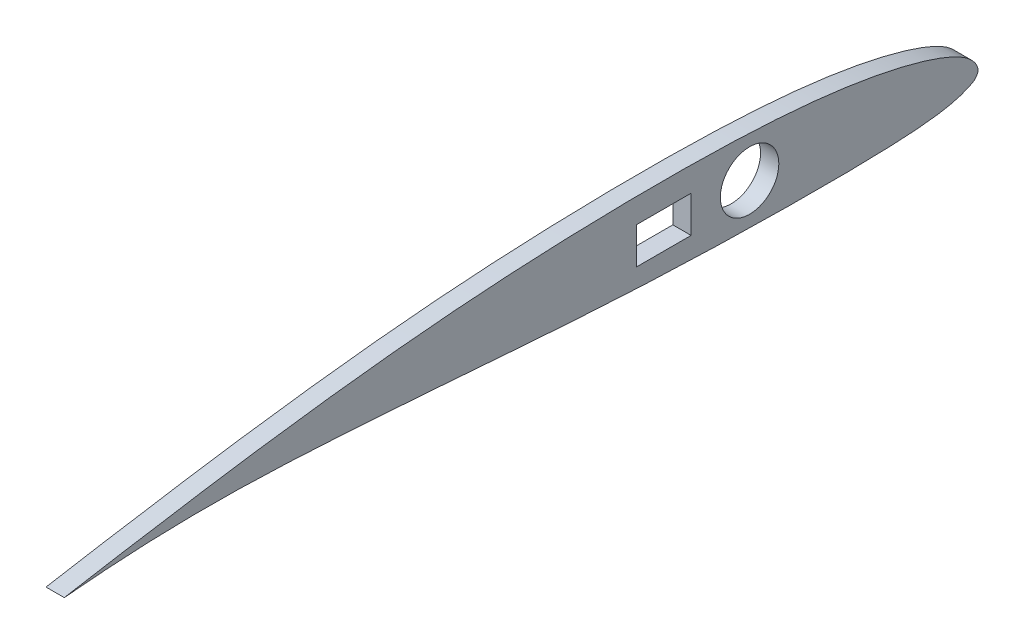
ISO-10303-21;
HEADER;
FILE_DESCRIPTION(('STEP AP214'),'2;1');
FILE_NAME('part.step','',(''),(''),'','','');
FILE_SCHEMA(('AUTOMOTIVE_DESIGN { 1 0 10303 214 1 1 1 1 }'));
ENDSEC;
DATA;
#1=APPLICATION_CONTEXT('core data for automotive mechanical design processes');
#2=APPLICATION_PROTOCOL_DEFINITION('international standard','automotive_design',2000,#1);
#3=PRODUCT_CONTEXT('',#1,'mechanical');
#4=PRODUCT('Part','Part','',(#3));
#5=PRODUCT_RELATED_PRODUCT_CATEGORY('part','',(#4));
#6=PRODUCT_DEFINITION_FORMATION('','',#4);
#7=PRODUCT_DEFINITION_CONTEXT('part definition',#1,'design');
#8=PRODUCT_DEFINITION('design','',#6,#7);
#9=PRODUCT_DEFINITION_SHAPE('','',#8);
#10=(LENGTH_UNIT() NAMED_UNIT(*) SI_UNIT(.MILLI.,.METRE.));
#11=(NAMED_UNIT(*) PLANE_ANGLE_UNIT() SI_UNIT($,.RADIAN.));
#12=(NAMED_UNIT(*) SI_UNIT($,.STERADIAN.) SOLID_ANGLE_UNIT());
#13=UNCERTAINTY_MEASURE_WITH_UNIT(LENGTH_MEASURE(1.E-05),#10,'distance_accuracy_value','');
#14=(GEOMETRIC_REPRESENTATION_CONTEXT(3) GLOBAL_UNCERTAINTY_ASSIGNED_CONTEXT((#13)) GLOBAL_UNIT_ASSIGNED_CONTEXT((#10,
#11,#12)) REPRESENTATION_CONTEXT('',''));
#15=CARTESIAN_POINT('',(0.,0.,0.));
#16=DIRECTION('',(0.,0.,1.));
#17=DIRECTION('',(1.,0.,0.));
#18=AXIS2_PLACEMENT_3D('',#15,#16,#17);
#19=CARTESIAN_POINT('',(5.,1.49711132773622,0.435092083404368));
#20=DIRECTION('',(-1.,0.,0.));
#21=DIRECTION('',(0.,0.,1.));
#22=AXIS2_PLACEMENT_3D('',#19,#20,#21);
#23=PLANE('',#22);
#24=CARTESIAN_POINT('',(5.,5.07732270373844,62.4999197093942));
#25=DIRECTION('',(1.,0.,0.));
#26=DIRECTION('',(0.,0.,-1.));
#27=AXIS2_PLACEMENT_3D('',#24,#25,#26);
#28=CIRCLE('',#27,8.);
#29=CARTESIAN_POINT('',(5.,5.07732270373844,54.4999197093942));
#30=VERTEX_POINT('',#29);
#31=EDGE_CURVE('E112',#30,#30,#28,.T.);
#32=ORIENTED_EDGE('',*,*,#31,.F.);
#33=EDGE_LOOP('',(#32));
#34=FACE_BOUND('',#33,.T.);
#35=CARTESIAN_POINT('',(5.,0.,250.));
#36=CARTESIAN_POINT('',(5.,-0.0080427959719715,250.000228293678));
#37=CARTESIAN_POINT('',(5.,0.172375657967406,248.284955515532));
#38=CARTESIAN_POINT('',(5.,0.308690014795419,246.518112419387));
#39=CARTESIAN_POINT('',(5.,0.685693593852336,242.189387343398));
#40=CARTESIAN_POINT('',(5.,1.07410152891603,236.806461263496));
#41=CARTESIAN_POINT('',(5.,1.49731723995003,229.680385951639));
#42=CARTESIAN_POINT('',(5.,1.8232186026768,221.18415869828));
#43=CARTESIAN_POINT('',(5.,1.96762610068065,211.337618207726));
#44=CARTESIAN_POINT('',(5.,1.83322105638369,200.371188527109));
#45=CARTESIAN_POINT('',(5.,1.38960528984164,188.499913622482));
#46=CARTESIAN_POINT('',(5.,0.706014078000893,175.953687417433));
#47=CARTESIAN_POINT('',(5.,-0.160208641561513,162.931424917666));
#48=CARTESIAN_POINT('',(5.,-1.14801632724376,149.615771743617));
#49=CARTESIAN_POINT('',(5.,-2.19092490983926,136.176354994724));
#50=CARTESIAN_POINT('',(5.,-3.21958397917046,122.767140548026));
#51=CARTESIAN_POINT('',(5.,-4.15274312671142,109.520053587455));
#52=CARTESIAN_POINT('',(5.,-4.93856436487493,96.5460959745437));
#53=CARTESIAN_POINT('',(5.,-5.53683070268675,83.9408193016427));
#54=CARTESIAN_POINT('',(5.,-5.94764820461108,71.8018392906514));
#55=CARTESIAN_POINT('',(5.,-6.21845093878312,60.2452560030716));
#56=CARTESIAN_POINT('',(5.,-6.35536975583973,49.3987328907547));
#57=CARTESIAN_POINT('',(5.,-6.38138796281789,39.3972261942655));
#58=CARTESIAN_POINT('',(5.,-6.26504923032313,30.3619348419668));
#59=CARTESIAN_POINT('',(5.,-6.01216491688521,22.4121811031587));
#60=CARTESIAN_POINT('',(5.,-5.59743390072595,15.6262272306516));
#61=CARTESIAN_POINT('',(5.,-4.92870657935606,10.0719075109048));
#62=CARTESIAN_POINT('',(5.,-4.04044698146404,5.69769261214423));
#63=CARTESIAN_POINT('',(5.,-2.8657529844069,2.62532063874475));
#64=CARTESIAN_POINT('',(5.,-1.7115284699546,0.494884225045661));
#65=CARTESIAN_POINT('',(5.,-0.410454230626488,-0.0213125491030087));
#66=CARTESIAN_POINT('',(5.,0.792659826704065,0.0311691995850224));
#67=CARTESIAN_POINT('',(5.,2.30568433693192,0.812599241892923));
#68=CARTESIAN_POINT('',(5.,4.23835242447377,2.72886351673443));
#69=CARTESIAN_POINT('',(5.,6.11817212106947,5.76990724125498));
#70=CARTESIAN_POINT('',(5.,7.91359420170391,9.88094280419771));
#71=CARTESIAN_POINT('',(5.,9.64131817838287,15.0749304677094));
#72=CARTESIAN_POINT('',(5.,11.2838964878058,21.2987522216172));
#73=CARTESIAN_POINT('',(5.,12.7883817585812,28.4971721202648));
#74=CARTESIAN_POINT('',(5.,14.0978349081275,36.6073734062479));
#75=CARTESIAN_POINT('',(5.,15.1594290171638,45.573028440303));
#76=CARTESIAN_POINT('',(5.,15.9609039979753,55.3329100744701));
#77=CARTESIAN_POINT('',(5.,16.4940697383882,65.8165364983871));
#78=CARTESIAN_POINT('',(5.,16.7919897051422,76.9313762604552));
#79=CARTESIAN_POINT('',(5.,16.864754130909,88.5669490281142));
#80=CARTESIAN_POINT('',(5.,16.7267152914356,100.596999885542));
#81=CARTESIAN_POINT('',(5.,16.3833850637257,112.888825982424));
#82=CARTESIAN_POINT('',(5.,15.825573666627,125.31161581915));
#83=CARTESIAN_POINT('',(5.,15.0523318700684,137.743791097076));
#84=CARTESIAN_POINT('',(5.,14.0593390742259,150.072384382085));
#85=CARTESIAN_POINT('',(5.,12.8815869860292,162.191375055682));
#86=CARTESIAN_POINT('',(5.,11.5492803460744,173.989074322246));
#87=CARTESIAN_POINT('',(5.,10.1162497290333,185.35236444642));
#88=CARTESIAN_POINT('',(5.,8.63237912523508,196.163081697706));
#89=CARTESIAN_POINT('',(5.,7.13151388385034,206.300441402258));
#90=CARTESIAN_POINT('',(5.,5.73122176805054,215.560350587015));
#91=CARTESIAN_POINT('',(5.,4.29329512716244,223.97715704258));
#92=CARTESIAN_POINT('',(5.,3.1818088737293,231.363413336396));
#93=CARTESIAN_POINT('',(5.,2.09894241729889,237.746440904332));
#94=CARTESIAN_POINT('',(5.,1.2458619166603,242.622069365861));
#95=CARTESIAN_POINT('',(5.,0.552864946230777,246.64452933247));
#96=CARTESIAN_POINT('',(5.,0.246216764640028,248.328398440367));
#97=CARTESIAN_POINT('',(5.,0.00797737724443801,249.999773563223));
#98=CARTESIAN_POINT('',(5.,0.,250.));
#99=B_SPLINE_CURVE_WITH_KNOTS('',3,(#35,#36,#37,#38,#39,#40,#41,#42,#43,#44,#45,#46,#47,#48,#49,
#50,#51,#52,#53,#54,#55,#56,#57,#58,#59,#60,#61,#62,#63,#64,#65,#66,#67,#68,#69,#70,#71,#72,#73,
#74,#75,#76,#77,#78,#79,#80,#81,#82,#83,#84,#85,#86,#87,#88,#89,#90,#91,#92,#93,#94,#95,#96,#97,
#98),.UNSPECIFIED.,.T.,.F.,(4,1,1,1,1,1,1,1,1,1,1,1,1,1,1,1,1,1,1,1,1,1,1,1,1,1,1,1,1,1,1,1,1,1,
1,1,1,1,1,1,1,1,1,1,1,1,1,1,1,1,1,1,1,1,1,1,1,1,1,1,1,4),(0.,0.00158888881614516,
0.00632921783555629,0.0142024564897436,0.0251728077530557,0.0391734833267743,0.0560606311759249,
0.0755789238487882,0.0973636066296903,0.120926258366677,0.145825281006277,0.171670911815127,
0.198108536705041,0.22479018357162,0.25139057978404,0.277643490654311,0.303326750051388,
0.328257458029316,0.352272548115194,0.375156061746876,0.396620664402003,0.416422729294005,
0.434304420097656,0.450054679859308,0.463465465082325,0.474478994238096,0.483169222153171,
0.489678354497499,0.494104066315722,0.496910015324886,0.497289784891853,0.501214273282496,
0.506457950332762,0.51335695674223,0.522168631834455,0.53296596992453,0.545689209241574,
0.56022077890382,0.57643892310517,0.594258689005965,0.613600244568652,0.634342385932902,
0.656331109263004,0.679351893859712,0.703152302846811,0.727478208080039,0.7520707394079,
0.776691163534608,0.801140183976245,0.825214386971546,0.848697423570622,0.871352857669295,
0.892947448931157,0.913230871058069,0.931955467148994,0.94834206907442,0.963693004275676,
0.976235918239566,0.986320058750392,0.993788799349345,0.998424034933867,1.),.UNSPECIFIED.);
#100=CARTESIAN_POINT('',(5.,0.,250.));
#101=VERTEX_POINT('',#100);
#102=EDGE_CURVE('E11',#101,#101,#99,.T.);
#103=ORIENTED_EDGE('',*,*,#102,.T.);
#104=EDGE_LOOP('',(#103));
#105=FACE_BOUND('',#104,.T.);
#106=DIRECTION('',(0.,1.,0.));
#107=VECTOR('',#106,1.);
#108=CARTESIAN_POINT('',(5.,10.0773227037384,78.4999197093942));
#109=LINE('',#108,#107);
#110=CARTESIAN_POINT('',(5.,0.0773227037384437,78.4999197093942));
#111=VERTEX_POINT('',#110);
#112=CARTESIAN_POINT('',(5.,10.0773227037384,78.4999197093942));
#113=VERTEX_POINT('',#112);
#114=EDGE_CURVE('E76',#111,#113,#109,.T.);
#115=ORIENTED_EDGE('',*,*,#114,.F.);
#116=DIRECTION('',(0.,0.,-1.));
#117=VECTOR('',#116,1.);
#118=CARTESIAN_POINT('',(5.,0.0773227037384437,78.4999197093942));
#119=LINE('',#118,#117);
#120=CARTESIAN_POINT('',(5.,0.0773227037384437,93.4999197093942));
#121=VERTEX_POINT('',#120);
#122=EDGE_CURVE('E98',#121,#111,#119,.T.);
#123=ORIENTED_EDGE('',*,*,#122,.F.);
#124=DIRECTION('',(0.,-1.,0.));
#125=VECTOR('',#124,1.);
#126=CARTESIAN_POINT('',(5.,10.0773227037384,93.4999197093942));
#127=LINE('',#126,#125);
#128=CARTESIAN_POINT('',(5.,10.0773227037384,93.4999197093942));
#129=VERTEX_POINT('',#128);
#130=EDGE_CURVE('E96',#129,#121,#127,.T.);
#131=ORIENTED_EDGE('',*,*,#130,.F.);
#132=DIRECTION('',(0.,0.,1.));
#133=VECTOR('',#132,1.);
#134=CARTESIAN_POINT('',(5.,10.0773227037384,78.4999197093942));
#135=LINE('',#134,#133);
#136=EDGE_CURVE('E84',#113,#129,#135,.T.);
#137=ORIENTED_EDGE('',*,*,#136,.F.);
#138=EDGE_LOOP('',(#115,#123,#131,#137));
#139=FACE_BOUND('',#138,.T.);
#140=ADVANCED_FACE('F33',(#34,#105,#139),#23,.F.);
#141=CARTESIAN_POINT('',(0.,1.49711132773622,0.435092083404368));
#142=DIRECTION('',(-1.,0.,0.));
#143=DIRECTION('',(0.,0.,1.));
#144=AXIS2_PLACEMENT_3D('',#141,#142,#143);
#145=PLANE('',#144);
#146=CARTESIAN_POINT('',(0.,0.,250.));
#147=CARTESIAN_POINT('',(0.,-0.0080427959719715,250.000228293678));
#148=CARTESIAN_POINT('',(0.,0.172375657967406,248.284955515532));
#149=CARTESIAN_POINT('',(0.,0.308690014795419,246.518112419387));
#150=CARTESIAN_POINT('',(0.,0.685693593852336,242.189387343398));
#151=CARTESIAN_POINT('',(0.,1.07410152891603,236.806461263496));
#152=CARTESIAN_POINT('',(0.,1.49731723995003,229.680385951639));
#153=CARTESIAN_POINT('',(0.,1.8232186026768,221.18415869828));
#154=CARTESIAN_POINT('',(0.,1.96762610068065,211.337618207726));
#155=CARTESIAN_POINT('',(0.,1.83322105638369,200.371188527109));
#156=CARTESIAN_POINT('',(0.,1.38960528984164,188.499913622482));
#157=CARTESIAN_POINT('',(0.,0.706014078000893,175.953687417433));
#158=CARTESIAN_POINT('',(0.,-0.160208641561513,162.931424917666));
#159=CARTESIAN_POINT('',(0.,-1.14801632724376,149.615771743617));
#160=CARTESIAN_POINT('',(0.,-2.19092490983926,136.176354994724));
#161=CARTESIAN_POINT('',(0.,-3.21958397917046,122.767140548026));
#162=CARTESIAN_POINT('',(0.,-4.15274312671142,109.520053587455));
#163=CARTESIAN_POINT('',(0.,-4.93856436487493,96.5460959745437));
#164=CARTESIAN_POINT('',(0.,-5.53683070268675,83.9408193016427));
#165=CARTESIAN_POINT('',(0.,-5.94764820461108,71.8018392906514));
#166=CARTESIAN_POINT('',(0.,-6.21845093878312,60.2452560030716));
#167=CARTESIAN_POINT('',(0.,-6.35536975583973,49.3987328907547));
#168=CARTESIAN_POINT('',(0.,-6.38138796281789,39.3972261942655));
#169=CARTESIAN_POINT('',(0.,-6.26504923032313,30.3619348419668));
#170=CARTESIAN_POINT('',(0.,-6.01216491688521,22.4121811031587));
#171=CARTESIAN_POINT('',(0.,-5.59743390072595,15.6262272306516));
#172=CARTESIAN_POINT('',(0.,-4.92870657935606,10.0719075109048));
#173=CARTESIAN_POINT('',(0.,-4.04044698146404,5.69769261214423));
#174=CARTESIAN_POINT('',(0.,-2.8657529844069,2.62532063874475));
#175=CARTESIAN_POINT('',(0.,-1.7115284699546,0.494884225045661));
#176=CARTESIAN_POINT('',(0.,-0.410454230626488,-0.0213125491030087));
#177=CARTESIAN_POINT('',(0.,0.792659826704065,0.0311691995850224));
#178=CARTESIAN_POINT('',(0.,2.30568433693192,0.812599241892923));
#179=CARTESIAN_POINT('',(0.,4.23835242447377,2.72886351673443));
#180=CARTESIAN_POINT('',(0.,6.11817212106947,5.76990724125498));
#181=CARTESIAN_POINT('',(0.,7.91359420170391,9.88094280419771));
#182=CARTESIAN_POINT('',(0.,9.64131817838287,15.0749304677094));
#183=CARTESIAN_POINT('',(0.,11.2838964878058,21.2987522216172));
#184=CARTESIAN_POINT('',(0.,12.7883817585812,28.4971721202648));
#185=CARTESIAN_POINT('',(0.,14.0978349081275,36.6073734062479));
#186=CARTESIAN_POINT('',(0.,15.1594290171638,45.573028440303));
#187=CARTESIAN_POINT('',(0.,15.9609039979753,55.3329100744701));
#188=CARTESIAN_POINT('',(0.,16.4940697383882,65.8165364983871));
#189=CARTESIAN_POINT('',(0.,16.7919897051422,76.9313762604552));
#190=CARTESIAN_POINT('',(0.,16.864754130909,88.5669490281142));
#191=CARTESIAN_POINT('',(0.,16.7267152914356,100.596999885542));
#192=CARTESIAN_POINT('',(0.,16.3833850637257,112.888825982424));
#193=CARTESIAN_POINT('',(0.,15.825573666627,125.31161581915));
#194=CARTESIAN_POINT('',(0.,15.0523318700684,137.743791097076));
#195=CARTESIAN_POINT('',(0.,14.0593390742259,150.072384382085));
#196=CARTESIAN_POINT('',(0.,12.8815869860292,162.191375055682));
#197=CARTESIAN_POINT('',(0.,11.5492803460744,173.989074322246));
#198=CARTESIAN_POINT('',(0.,10.1162497290333,185.35236444642));
#199=CARTESIAN_POINT('',(0.,8.63237912523508,196.163081697706));
#200=CARTESIAN_POINT('',(0.,7.13151388385034,206.300441402258));
#201=CARTESIAN_POINT('',(0.,5.73122176805054,215.560350587015));
#202=CARTESIAN_POINT('',(0.,4.29329512716244,223.97715704258));
#203=CARTESIAN_POINT('',(0.,3.1818088737293,231.363413336396));
#204=CARTESIAN_POINT('',(0.,2.09894241729889,237.746440904332));
#205=CARTESIAN_POINT('',(0.,1.2458619166603,242.622069365861));
#206=CARTESIAN_POINT('',(0.,0.552864946230777,246.64452933247));
#207=CARTESIAN_POINT('',(0.,0.246216764640028,248.328398440367));
#208=CARTESIAN_POINT('',(0.,0.00797737724443801,249.999773563223));
#209=CARTESIAN_POINT('',(0.,0.,250.));
#210=B_SPLINE_CURVE_WITH_KNOTS('',3,(#146,#147,#148,#149,#150,#151,#152,#153,#154,#155,#156,
#157,#158,#159,#160,#161,#162,#163,#164,#165,#166,#167,#168,#169,#170,#171,#172,#173,#174,#175,
#176,#177,#178,#179,#180,#181,#182,#183,#184,#185,#186,#187,#188,#189,#190,#191,#192,#193,#194,
#195,#196,#197,#198,#199,#200,#201,#202,#203,#204,#205,#206,#207,#208,#209),.UNSPECIFIED.,.T.,
.F.,(4,1,1,1,1,1,1,1,1,1,1,1,1,1,1,1,1,1,1,1,1,1,1,1,1,1,1,1,1,1,1,1,1,1,1,1,1,1,1,1,1,1,1,1,1,
1,1,1,1,1,1,1,1,1,1,1,1,1,1,1,1,4),(0.,0.00158888881614516,0.00632921783555629,
0.0142024564897436,0.0251728077530557,0.0391734833267743,0.0560606311759249,0.0755789238487882,
0.0973636066296903,0.120926258366677,0.145825281006277,0.171670911815127,0.198108536705041,
0.22479018357162,0.25139057978404,0.277643490654311,0.303326750051388,0.328257458029316,
0.352272548115194,0.375156061746876,0.396620664402003,0.416422729294005,0.434304420097656,
0.450054679859308,0.463465465082325,0.474478994238096,0.483169222153171,0.489678354497499,
0.494104066315722,0.496910015324886,0.497289784891853,0.501214273282496,0.506457950332762,
0.51335695674223,0.522168631834455,0.53296596992453,0.545689209241574,0.56022077890382,
0.57643892310517,0.594258689005965,0.613600244568652,0.634342385932902,0.656331109263004,
0.679351893859712,0.703152302846811,0.727478208080039,0.7520707394079,0.776691163534608,
0.801140183976245,0.825214386971546,0.848697423570622,0.871352857669295,0.892947448931157,
0.913230871058069,0.931955467148994,0.94834206907442,0.963693004275676,0.976235918239566,
0.986320058750392,0.993788799349345,0.998424034933867,1.),.UNSPECIFIED.);
#211=CARTESIAN_POINT('',(0.,0.,250.));
#212=VERTEX_POINT('',#211);
#213=EDGE_CURVE('E38',#212,#212,#210,.T.);
#214=ORIENTED_EDGE('',*,*,#213,.F.);
#215=EDGE_LOOP('',(#214));
#216=FACE_BOUND('',#215,.T.);
#217=CARTESIAN_POINT('',(0.,5.07732270373844,62.4999197093942));
#218=DIRECTION('',(1.,0.,0.));
#219=DIRECTION('',(0.,0.,-1.));
#220=AXIS2_PLACEMENT_3D('',#217,#218,#219);
#221=CIRCLE('',#220,8.);
#222=CARTESIAN_POINT('',(0.,5.07732270373844,54.4999197093942));
#223=VERTEX_POINT('',#222);
#224=EDGE_CURVE('E92',#223,#223,#221,.T.);
#225=ORIENTED_EDGE('',*,*,#224,.T.);
#226=EDGE_LOOP('',(#225));
#227=FACE_BOUND('',#226,.T.);
#228=DIRECTION('',(0.,0.,-1.));
#229=VECTOR('',#228,1.);
#230=CARTESIAN_POINT('',(0.,0.0773227037384437,78.4999197093942));
#231=LINE('',#230,#229);
#232=CARTESIAN_POINT('',(0.,0.0773227037384437,93.4999197093942));
#233=VERTEX_POINT('',#232);
#234=CARTESIAN_POINT('',(0.,0.0773227037384437,78.4999197093942));
#235=VERTEX_POINT('',#234);
#236=EDGE_CURVE('E85',#233,#235,#231,.T.);
#237=ORIENTED_EDGE('',*,*,#236,.T.);
#238=DIRECTION('',(0.,1.,0.));
#239=VECTOR('',#238,1.);
#240=CARTESIAN_POINT('',(0.,10.0773227037384,78.4999197093942));
#241=LINE('',#240,#239);
#242=CARTESIAN_POINT('',(0.,10.0773227037384,78.4999197093942));
#243=VERTEX_POINT('',#242);
#244=EDGE_CURVE('E58',#235,#243,#241,.T.);
#245=ORIENTED_EDGE('',*,*,#244,.T.);
#246=DIRECTION('',(0.,0.,1.));
#247=VECTOR('',#246,1.);
#248=CARTESIAN_POINT('',(0.,10.0773227037384,78.4999197093942));
#249=LINE('',#248,#247);
#250=CARTESIAN_POINT('',(0.,10.0773227037384,93.4999197093942));
#251=VERTEX_POINT('',#250);
#252=EDGE_CURVE('E91',#243,#251,#249,.T.);
#253=ORIENTED_EDGE('',*,*,#252,.T.);
#254=DIRECTION('',(0.,-1.,0.));
#255=VECTOR('',#254,1.);
#256=CARTESIAN_POINT('',(0.,10.0773227037384,93.4999197093942));
#257=LINE('',#256,#255);
#258=EDGE_CURVE('E104',#251,#233,#257,.T.);
#259=ORIENTED_EDGE('',*,*,#258,.T.);
#260=EDGE_LOOP('',(#237,#245,#253,#259));
#261=FACE_BOUND('',#260,.T.);
#262=ADVANCED_FACE('F124',(#216,#227,#261),#145,.T.);
#263=DIRECTION('',(-1.,0.,0.));
#264=VECTOR('',#263,1.);
#265=SURFACE_OF_LINEAR_EXTRUSION('',#99,#264);
#266=ORIENTED_EDGE('',*,*,#102,.F.);
#267=EDGE_LOOP('',(#266));
#268=FACE_BOUND('',#267,.T.);
#269=ORIENTED_EDGE('',*,*,#213,.T.);
#270=EDGE_LOOP('',(#269));
#271=FACE_BOUND('',#270,.T.);
#272=ADVANCED_FACE('F35',(#268,#271),#265,.F.);
#273=CARTESIAN_POINT('',(5.,5.07732270373844,62.4999197093942));
#274=DIRECTION('',(-1.,0.,0.));
#275=DIRECTION('',(0.,0.,1.));
#276=AXIS2_PLACEMENT_3D('',#273,#274,#275);
#277=CYLINDRICAL_SURFACE('',#276,8.);
#278=ORIENTED_EDGE('',*,*,#31,.T.);
#279=EDGE_LOOP('',(#278));
#280=FACE_BOUND('',#279,.T.);
#281=ORIENTED_EDGE('',*,*,#224,.F.);
#282=EDGE_LOOP('',(#281));
#283=FACE_BOUND('',#282,.T.);
#284=ADVANCED_FACE('F127',(#280,#283),#277,.F.);
#285=CARTESIAN_POINT('',(5.,10.0773227037384,78.4999197093942));
#286=DIRECTION('',(0.,0.,1.));
#287=DIRECTION('',(1.,0.,0.));
#288=AXIS2_PLACEMENT_3D('',#285,#286,#287);
#289=PLANE('',#288);
#290=ORIENTED_EDGE('',*,*,#244,.F.);
#291=DIRECTION('',(-1.,0.,0.));
#292=VECTOR('',#291,1.);
#293=CARTESIAN_POINT('',(5.,0.0773227037384437,78.4999197093942));
#294=LINE('',#293,#292);
#295=EDGE_CURVE('E80',#111,#235,#294,.T.);
#296=ORIENTED_EDGE('',*,*,#295,.F.);
#297=ORIENTED_EDGE('',*,*,#114,.T.);
#298=DIRECTION('',(-1.,0.,0.));
#299=VECTOR('',#298,1.);
#300=CARTESIAN_POINT('',(5.,10.0773227037384,78.4999197093942));
#301=LINE('',#300,#299);
#302=EDGE_CURVE('E79',#113,#243,#301,.T.);
#303=ORIENTED_EDGE('',*,*,#302,.T.);
#304=EDGE_LOOP('',(#290,#296,#297,#303));
#305=FACE_BOUND('',#304,.T.);
#306=ADVANCED_FACE('F78',(#305),#289,.T.);
#307=CARTESIAN_POINT('',(5.,10.0773227037384,78.4999197093942));
#308=DIRECTION('',(0.,-1.,0.));
#309=DIRECTION('',(0.,0.,-1.));
#310=AXIS2_PLACEMENT_3D('',#307,#308,#309);
#311=PLANE('',#310);
#312=ORIENTED_EDGE('',*,*,#252,.F.);
#313=ORIENTED_EDGE('',*,*,#302,.F.);
#314=ORIENTED_EDGE('',*,*,#136,.T.);
#315=DIRECTION('',(-1.,0.,0.));
#316=VECTOR('',#315,1.);
#317=CARTESIAN_POINT('',(5.,10.0773227037384,93.4999197093942));
#318=LINE('',#317,#316);
#319=EDGE_CURVE('E93',#129,#251,#318,.T.);
#320=ORIENTED_EDGE('',*,*,#319,.T.);
#321=EDGE_LOOP('',(#312,#313,#314,#320));
#322=FACE_BOUND('',#321,.T.);
#323=ADVANCED_FACE('F88',(#322),#311,.T.);
#324=CARTESIAN_POINT('',(5.,10.0773227037384,93.4999197093942));
#325=DIRECTION('',(0.,0.,-1.));
#326=DIRECTION('',(-1.,0.,0.));
#327=AXIS2_PLACEMENT_3D('',#324,#325,#326);
#328=PLANE('',#327);
#329=ORIENTED_EDGE('',*,*,#258,.F.);
#330=ORIENTED_EDGE('',*,*,#319,.F.);
#331=ORIENTED_EDGE('',*,*,#130,.T.);
#332=DIRECTION('',(-1.,0.,0.));
#333=VECTOR('',#332,1.);
#334=CARTESIAN_POINT('',(5.,0.0773227037384437,93.4999197093942));
#335=LINE('',#334,#333);
#336=EDGE_CURVE('E50',#121,#233,#335,.T.);
#337=ORIENTED_EDGE('',*,*,#336,.T.);
#338=EDGE_LOOP('',(#329,#330,#331,#337));
#339=FACE_BOUND('',#338,.T.);
#340=ADVANCED_FACE('F175',(#339),#328,.T.);
#341=CARTESIAN_POINT('',(5.,0.0773227037384437,78.4999197093942));
#342=DIRECTION('',(0.,1.,0.));
#343=DIRECTION('',(0.,0.,1.));
#344=AXIS2_PLACEMENT_3D('',#341,#342,#343);
#345=PLANE('',#344);
#346=ORIENTED_EDGE('',*,*,#236,.F.);
#347=ORIENTED_EDGE('',*,*,#336,.F.);
#348=ORIENTED_EDGE('',*,*,#122,.T.);
#349=ORIENTED_EDGE('',*,*,#295,.T.);
#350=EDGE_LOOP('',(#346,#347,#348,#349));
#351=FACE_BOUND('',#350,.T.);
#352=ADVANCED_FACE('F184',(#351),#345,.T.);
#353=CLOSED_SHELL('',(#140,#262,#272,#284,#306,#323,#340,#352));
#354=MANIFOLD_SOLID_BREP('B2',#353);
#355=ADVANCED_BREP_SHAPE_REPRESENTATION('',(#18,#354),#14);
#356=SHAPE_DEFINITION_REPRESENTATION(#9,#355);
ENDSEC;
END-ISO-10303-21;
